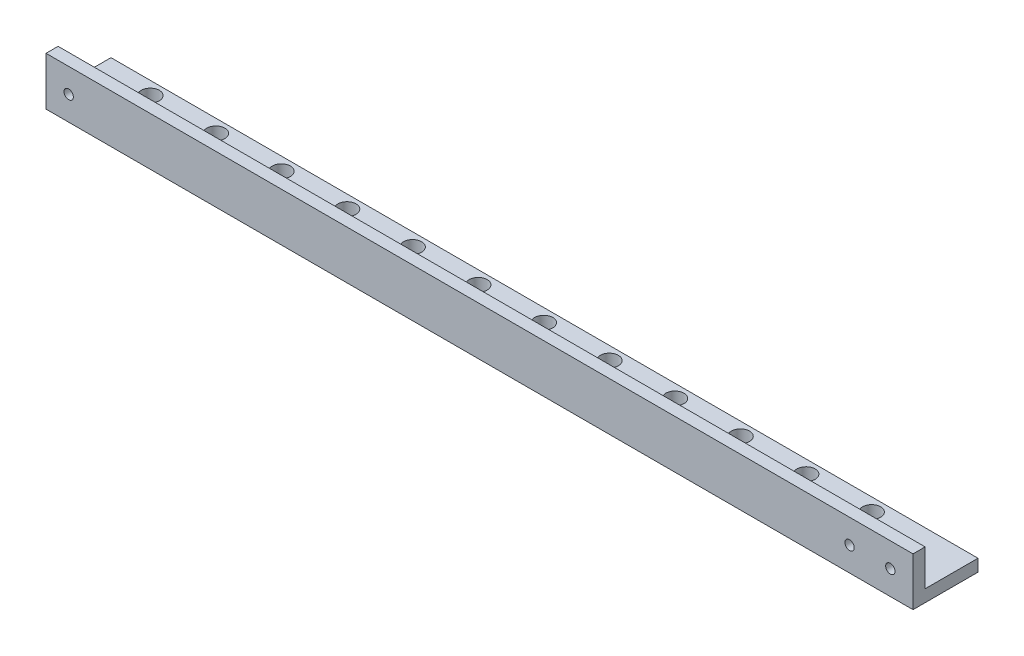
ISO-10303-21;
HEADER;
FILE_DESCRIPTION(('STEP AP214'),'2;1');
FILE_NAME('part.step','',(''),(''),'','','');
FILE_SCHEMA(('AUTOMOTIVE_DESIGN { 1 0 10303 214 1 1 1 1 }'));
ENDSEC;
DATA;
#1=APPLICATION_CONTEXT('core data for automotive mechanical design processes');
#2=APPLICATION_PROTOCOL_DEFINITION('international standard','automotive_design',2000,#1);
#3=PRODUCT_CONTEXT('',#1,'mechanical');
#4=PRODUCT('Part','Part','',(#3));
#5=PRODUCT_RELATED_PRODUCT_CATEGORY('part','',(#4));
#6=PRODUCT_DEFINITION_FORMATION('','',#4);
#7=PRODUCT_DEFINITION_CONTEXT('part definition',#1,'design');
#8=PRODUCT_DEFINITION('design','',#6,#7);
#9=PRODUCT_DEFINITION_SHAPE('','',#8);
#10=(LENGTH_UNIT() NAMED_UNIT(*) SI_UNIT(.MILLI.,.METRE.));
#11=(NAMED_UNIT(*) PLANE_ANGLE_UNIT() SI_UNIT($,.RADIAN.));
#12=(NAMED_UNIT(*) SI_UNIT($,.STERADIAN.) SOLID_ANGLE_UNIT());
#13=UNCERTAINTY_MEASURE_WITH_UNIT(LENGTH_MEASURE(1.E-05),#10,'distance_accuracy_value','');
#14=(GEOMETRIC_REPRESENTATION_CONTEXT(3) GLOBAL_UNCERTAINTY_ASSIGNED_CONTEXT((#13)) GLOBAL_UNIT_ASSIGNED_CONTEXT((#10,
#11,#12)) REPRESENTATION_CONTEXT('',''));
#15=CARTESIAN_POINT('',(0.,0.,0.));
#16=DIRECTION('',(0.,0.,1.));
#17=DIRECTION('',(1.,0.,0.));
#18=AXIS2_PLACEMENT_3D('',#15,#16,#17);
#19=CARTESIAN_POINT('',(0.,4.,0.));
#20=DIRECTION('',(0.,1.,0.));
#21=DIRECTION('',(0.,0.,1.));
#22=AXIS2_PLACEMENT_3D('',#19,#20,#21);
#23=PLANE('',#22);
#24=CARTESIAN_POINT('',(217.,4.,0.));
#25=DIRECTION('',(0.,1.,0.));
#26=DIRECTION('',(0.,0.,1.));
#27=AXIS2_PLACEMENT_3D('',#24,#25,#26);
#28=CIRCLE('',#27,2.99999999999999);
#29=CARTESIAN_POINT('',(217.,4.,2.99999999999999));
#30=VERTEX_POINT('',#29);
#31=EDGE_CURVE('E159',#30,#30,#28,.T.);
#32=ORIENTED_EDGE('',*,*,#31,.F.);
#33=EDGE_LOOP('',(#32));
#34=FACE_BOUND('',#33,.T.);
#35=CARTESIAN_POINT('',(173.6,4.,0.));
#36=DIRECTION('',(0.,1.,0.));
#37=DIRECTION('',(0.,0.,1.));
#38=AXIS2_PLACEMENT_3D('',#35,#36,#37);
#39=CIRCLE('',#38,2.99999999999999);
#40=CARTESIAN_POINT('',(173.6,4.,2.99999999999999));
#41=VERTEX_POINT('',#40);
#42=EDGE_CURVE('E171',#41,#41,#39,.T.);
#43=ORIENTED_EDGE('',*,*,#42,.F.);
#44=EDGE_LOOP('',(#43));
#45=FACE_BOUND('',#44,.T.);
#46=CARTESIAN_POINT('',(130.2,4.,0.));
#47=DIRECTION('',(0.,1.,0.));
#48=DIRECTION('',(0.,0.,1.));
#49=AXIS2_PLACEMENT_3D('',#46,#47,#48);
#50=CIRCLE('',#49,2.99999999999999);
#51=CARTESIAN_POINT('',(130.2,4.,2.99999999999999));
#52=VERTEX_POINT('',#51);
#53=EDGE_CURVE('E183',#52,#52,#50,.T.);
#54=ORIENTED_EDGE('',*,*,#53,.F.);
#55=EDGE_LOOP('',(#54));
#56=FACE_BOUND('',#55,.T.);
#57=CARTESIAN_POINT('',(86.8,4.,0.));
#58=DIRECTION('',(0.,1.,0.));
#59=DIRECTION('',(0.,0.,1.));
#60=AXIS2_PLACEMENT_3D('',#57,#58,#59);
#61=CIRCLE('',#60,2.99999999999999);
#62=CARTESIAN_POINT('',(86.8,4.,2.99999999999999));
#63=VERTEX_POINT('',#62);
#64=EDGE_CURVE('E195',#63,#63,#61,.T.);
#65=ORIENTED_EDGE('',*,*,#64,.F.);
#66=EDGE_LOOP('',(#65));
#67=FACE_BOUND('',#66,.T.);
#68=CARTESIAN_POINT('',(43.4,4.,0.));
#69=DIRECTION('',(0.,1.,0.));
#70=DIRECTION('',(0.,0.,1.));
#71=AXIS2_PLACEMENT_3D('',#68,#69,#70);
#72=CIRCLE('',#71,3.);
#73=CARTESIAN_POINT('',(43.4,4.,3.));
#74=VERTEX_POINT('',#73);
#75=EDGE_CURVE('E207',#74,#74,#72,.T.);
#76=ORIENTED_EDGE('',*,*,#75,.F.);
#77=EDGE_LOOP('',(#76));
#78=FACE_BOUND('',#77,.T.);
#79=CARTESIAN_POINT('',(0.,4.,0.));
#80=DIRECTION('',(0.,1.,0.));
#81=DIRECTION('',(0.,0.,1.));
#82=AXIS2_PLACEMENT_3D('',#79,#80,#81);
#83=CIRCLE('',#82,3.);
#84=CARTESIAN_POINT('',(0.,4.,3.));
#85=VERTEX_POINT('',#84);
#86=EDGE_CURVE('E97',#85,#85,#83,.T.);
#87=ORIENTED_EDGE('',*,*,#86,.F.);
#88=EDGE_LOOP('',(#87));
#89=FACE_BOUND('',#88,.T.);
#90=CARTESIAN_POINT('',(21.7,4.,0.));
#91=DIRECTION('',(0.,1.,0.));
#92=DIRECTION('',(0.,0.,1.));
#93=AXIS2_PLACEMENT_3D('',#90,#91,#92);
#94=CIRCLE('',#93,3.);
#95=CARTESIAN_POINT('',(21.7,4.,3.));
#96=VERTEX_POINT('',#95);
#97=EDGE_CURVE('E213',#96,#96,#94,.T.);
#98=ORIENTED_EDGE('',*,*,#97,.F.);
#99=EDGE_LOOP('',(#98));
#100=FACE_BOUND('',#99,.T.);
#101=CARTESIAN_POINT('',(65.1,4.,0.));
#102=DIRECTION('',(0.,1.,0.));
#103=DIRECTION('',(0.,0.,1.));
#104=AXIS2_PLACEMENT_3D('',#101,#102,#103);
#105=CIRCLE('',#104,2.99999999999999);
#106=CARTESIAN_POINT('',(65.1,4.,2.99999999999999));
#107=VERTEX_POINT('',#106);
#108=EDGE_CURVE('E201',#107,#107,#105,.T.);
#109=ORIENTED_EDGE('',*,*,#108,.F.);
#110=EDGE_LOOP('',(#109));
#111=FACE_BOUND('',#110,.T.);
#112=CARTESIAN_POINT('',(108.5,4.,0.));
#113=DIRECTION('',(0.,1.,0.));
#114=DIRECTION('',(0.,0.,1.));
#115=AXIS2_PLACEMENT_3D('',#112,#113,#114);
#116=CIRCLE('',#115,2.99999999999999);
#117=CARTESIAN_POINT('',(108.5,4.,2.99999999999999));
#118=VERTEX_POINT('',#117);
#119=EDGE_CURVE('E189',#118,#118,#116,.T.);
#120=ORIENTED_EDGE('',*,*,#119,.F.);
#121=EDGE_LOOP('',(#120));
#122=FACE_BOUND('',#121,.T.);
#123=CARTESIAN_POINT('',(151.9,4.,0.));
#124=DIRECTION('',(0.,1.,0.));
#125=DIRECTION('',(0.,0.,1.));
#126=AXIS2_PLACEMENT_3D('',#123,#124,#125);
#127=CIRCLE('',#126,2.99999999999999);
#128=CARTESIAN_POINT('',(151.9,4.,2.99999999999999));
#129=VERTEX_POINT('',#128);
#130=EDGE_CURVE('E177',#129,#129,#127,.T.);
#131=ORIENTED_EDGE('',*,*,#130,.F.);
#132=EDGE_LOOP('',(#131));
#133=FACE_BOUND('',#132,.T.);
#134=CARTESIAN_POINT('',(195.3,4.,0.));
#135=DIRECTION('',(0.,1.,0.));
#136=DIRECTION('',(0.,0.,1.));
#137=AXIS2_PLACEMENT_3D('',#134,#135,#136);
#138=CIRCLE('',#137,2.99999999999999);
#139=CARTESIAN_POINT('',(195.3,4.,2.99999999999999));
#140=VERTEX_POINT('',#139);
#141=EDGE_CURVE('E165',#140,#140,#138,.T.);
#142=ORIENTED_EDGE('',*,*,#141,.F.);
#143=EDGE_LOOP('',(#142));
#144=FACE_BOUND('',#143,.T.);
#145=CARTESIAN_POINT('',(238.7,4.,0.));
#146=DIRECTION('',(0.,1.,0.));
#147=DIRECTION('',(0.,0.,1.));
#148=AXIS2_PLACEMENT_3D('',#145,#146,#147);
#149=CIRCLE('',#148,2.99999999999999);
#150=CARTESIAN_POINT('',(238.7,4.,2.99999999999999));
#151=VERTEX_POINT('',#150);
#152=EDGE_CURVE('E153',#151,#151,#149,.T.);
#153=ORIENTED_EDGE('',*,*,#152,.F.);
#154=EDGE_LOOP('',(#153));
#155=FACE_BOUND('',#154,.T.);
#156=DIRECTION('',(0.,0.,1.));
#157=VECTOR('',#156,1.);
#158=CARTESIAN_POINT('',(-17.35,4.,-4.35));
#159=LINE('',#158,#157);
#160=CARTESIAN_POINT('',(-17.35,4.,-4.35));
#161=VERTEX_POINT('',#160);
#162=CARTESIAN_POINT('',(-17.35,3.99999999999997,13.15));
#163=VERTEX_POINT('',#162);
#164=EDGE_CURVE('E85',#161,#163,#159,.T.);
#165=ORIENTED_EDGE('',*,*,#164,.T.);
#166=DIRECTION('',(1.,0.,0.));
#167=VECTOR('',#166,1.);
#168=CARTESIAN_POINT('',(269.55,4.,13.15));
#169=LINE('',#168,#167);
#170=CARTESIAN_POINT('',(269.55,4.,13.15));
#171=VERTEX_POINT('',#170);
#172=EDGE_CURVE('E134',#163,#171,#169,.T.);
#173=ORIENTED_EDGE('',*,*,#172,.T.);
#174=DIRECTION('',(0.,0.,-1.));
#175=VECTOR('',#174,1.);
#176=CARTESIAN_POINT('',(269.55,4.,-4.35));
#177=LINE('',#176,#175);
#178=CARTESIAN_POINT('',(269.55,4.,-4.35));
#179=VERTEX_POINT('',#178);
#180=EDGE_CURVE('E141',#171,#179,#177,.T.);
#181=ORIENTED_EDGE('',*,*,#180,.T.);
#182=DIRECTION('',(-1.,0.,0.));
#183=VECTOR('',#182,1.);
#184=CARTESIAN_POINT('',(-17.35,4.,-4.35));
#185=LINE('',#184,#183);
#186=EDGE_CURVE('E56',#179,#161,#185,.T.);
#187=ORIENTED_EDGE('',*,*,#186,.T.);
#188=EDGE_LOOP('',(#165,#173,#181,#187));
#189=FACE_BOUND('',#188,.T.);
#190=ADVANCED_FACE('F32',(#34,#45,#56,#67,#78,#89,#100,#111,#122,#133,#144,#155,#189),#23,.T.);
#191=CARTESIAN_POINT('',(0.,0.,0.));
#192=DIRECTION('',(0.,1.,0.));
#193=DIRECTION('',(0.,0.,1.));
#194=AXIS2_PLACEMENT_3D('',#191,#192,#193);
#195=PLANE('',#194);
#196=DIRECTION('',(0.,0.,1.));
#197=VECTOR('',#196,1.);
#198=CARTESIAN_POINT('',(-17.35,0.,-4.35));
#199=LINE('',#198,#197);
#200=CARTESIAN_POINT('',(-17.35,0.,-4.35));
#201=VERTEX_POINT('',#200);
#202=CARTESIAN_POINT('',(-17.35,0.,17.15));
#203=VERTEX_POINT('',#202);
#204=EDGE_CURVE('E91',#201,#203,#199,.T.);
#205=ORIENTED_EDGE('',*,*,#204,.F.);
#206=DIRECTION('',(-1.,0.,0.));
#207=VECTOR('',#206,1.);
#208=CARTESIAN_POINT('',(-17.35,0.,-4.35));
#209=LINE('',#208,#207);
#210=CARTESIAN_POINT('',(269.55,0.,-4.35));
#211=VERTEX_POINT('',#210);
#212=EDGE_CURVE('E75',#211,#201,#209,.T.);
#213=ORIENTED_EDGE('',*,*,#212,.F.);
#214=DIRECTION('',(0.,0.,-1.));
#215=VECTOR('',#214,1.);
#216=CARTESIAN_POINT('',(269.55,0.,-4.35));
#217=LINE('',#216,#215);
#218=CARTESIAN_POINT('',(269.55,0.,17.15));
#219=VERTEX_POINT('',#218);
#220=EDGE_CURVE('E86',#219,#211,#217,.T.);
#221=ORIENTED_EDGE('',*,*,#220,.F.);
#222=DIRECTION('',(1.,0.,0.));
#223=VECTOR('',#222,1.);
#224=CARTESIAN_POINT('',(-17.35,0.,17.15));
#225=LINE('',#224,#223);
#226=EDGE_CURVE('E96',#203,#219,#225,.T.);
#227=ORIENTED_EDGE('',*,*,#226,.F.);
#228=EDGE_LOOP('',(#205,#213,#221,#227));
#229=FACE_BOUND('',#228,.T.);
#230=CARTESIAN_POINT('',(0.,0.,0.));
#231=DIRECTION('',(0.,1.,0.));
#232=DIRECTION('',(0.,0.,1.));
#233=AXIS2_PLACEMENT_3D('',#230,#231,#232);
#234=CIRCLE('',#233,3.);
#235=CARTESIAN_POINT('',(0.,0.,3.));
#236=VERTEX_POINT('',#235);
#237=EDGE_CURVE('E101',#236,#236,#234,.T.);
#238=ORIENTED_EDGE('',*,*,#237,.T.);
#239=EDGE_LOOP('',(#238));
#240=FACE_BOUND('',#239,.T.);
#241=CARTESIAN_POINT('',(21.7,0.,0.));
#242=DIRECTION('',(0.,1.,0.));
#243=DIRECTION('',(0.,0.,1.));
#244=AXIS2_PLACEMENT_3D('',#241,#242,#243);
#245=CIRCLE('',#244,3.);
#246=CARTESIAN_POINT('',(21.7,0.,3.));
#247=VERTEX_POINT('',#246);
#248=EDGE_CURVE('E210',#247,#247,#245,.T.);
#249=ORIENTED_EDGE('',*,*,#248,.T.);
#250=EDGE_LOOP('',(#249));
#251=FACE_BOUND('',#250,.T.);
#252=CARTESIAN_POINT('',(43.4,0.,0.));
#253=DIRECTION('',(0.,1.,0.));
#254=DIRECTION('',(0.,0.,1.));
#255=AXIS2_PLACEMENT_3D('',#252,#253,#254);
#256=CIRCLE('',#255,3.);
#257=CARTESIAN_POINT('',(43.4,0.,3.));
#258=VERTEX_POINT('',#257);
#259=EDGE_CURVE('E204',#258,#258,#256,.T.);
#260=ORIENTED_EDGE('',*,*,#259,.T.);
#261=EDGE_LOOP('',(#260));
#262=FACE_BOUND('',#261,.T.);
#263=CARTESIAN_POINT('',(65.1,0.,0.));
#264=DIRECTION('',(0.,1.,0.));
#265=DIRECTION('',(0.,0.,1.));
#266=AXIS2_PLACEMENT_3D('',#263,#264,#265);
#267=CIRCLE('',#266,2.99999999999999);
#268=CARTESIAN_POINT('',(65.1,0.,2.99999999999999));
#269=VERTEX_POINT('',#268);
#270=EDGE_CURVE('E198',#269,#269,#267,.T.);
#271=ORIENTED_EDGE('',*,*,#270,.T.);
#272=EDGE_LOOP('',(#271));
#273=FACE_BOUND('',#272,.T.);
#274=CARTESIAN_POINT('',(86.8,0.,0.));
#275=DIRECTION('',(0.,1.,0.));
#276=DIRECTION('',(0.,0.,1.));
#277=AXIS2_PLACEMENT_3D('',#274,#275,#276);
#278=CIRCLE('',#277,2.99999999999999);
#279=CARTESIAN_POINT('',(86.8,0.,2.99999999999999));
#280=VERTEX_POINT('',#279);
#281=EDGE_CURVE('E192',#280,#280,#278,.T.);
#282=ORIENTED_EDGE('',*,*,#281,.T.);
#283=EDGE_LOOP('',(#282));
#284=FACE_BOUND('',#283,.T.);
#285=CARTESIAN_POINT('',(108.5,0.,0.));
#286=DIRECTION('',(0.,1.,0.));
#287=DIRECTION('',(0.,0.,1.));
#288=AXIS2_PLACEMENT_3D('',#285,#286,#287);
#289=CIRCLE('',#288,2.99999999999999);
#290=CARTESIAN_POINT('',(108.5,0.,2.99999999999999));
#291=VERTEX_POINT('',#290);
#292=EDGE_CURVE('E186',#291,#291,#289,.T.);
#293=ORIENTED_EDGE('',*,*,#292,.T.);
#294=EDGE_LOOP('',(#293));
#295=FACE_BOUND('',#294,.T.);
#296=CARTESIAN_POINT('',(130.2,0.,0.));
#297=DIRECTION('',(0.,1.,0.));
#298=DIRECTION('',(0.,0.,1.));
#299=AXIS2_PLACEMENT_3D('',#296,#297,#298);
#300=CIRCLE('',#299,2.99999999999999);
#301=CARTESIAN_POINT('',(130.2,0.,2.99999999999999));
#302=VERTEX_POINT('',#301);
#303=EDGE_CURVE('E180',#302,#302,#300,.T.);
#304=ORIENTED_EDGE('',*,*,#303,.T.);
#305=EDGE_LOOP('',(#304));
#306=FACE_BOUND('',#305,.T.);
#307=CARTESIAN_POINT('',(151.9,0.,0.));
#308=DIRECTION('',(0.,1.,0.));
#309=DIRECTION('',(0.,0.,1.));
#310=AXIS2_PLACEMENT_3D('',#307,#308,#309);
#311=CIRCLE('',#310,2.99999999999999);
#312=CARTESIAN_POINT('',(151.9,0.,2.99999999999999));
#313=VERTEX_POINT('',#312);
#314=EDGE_CURVE('E174',#313,#313,#311,.T.);
#315=ORIENTED_EDGE('',*,*,#314,.T.);
#316=EDGE_LOOP('',(#315));
#317=FACE_BOUND('',#316,.T.);
#318=CARTESIAN_POINT('',(173.6,0.,0.));
#319=DIRECTION('',(0.,1.,0.));
#320=DIRECTION('',(0.,0.,1.));
#321=AXIS2_PLACEMENT_3D('',#318,#319,#320);
#322=CIRCLE('',#321,2.99999999999999);
#323=CARTESIAN_POINT('',(173.6,0.,2.99999999999999));
#324=VERTEX_POINT('',#323);
#325=EDGE_CURVE('E168',#324,#324,#322,.T.);
#326=ORIENTED_EDGE('',*,*,#325,.T.);
#327=EDGE_LOOP('',(#326));
#328=FACE_BOUND('',#327,.T.);
#329=CARTESIAN_POINT('',(195.3,0.,0.));
#330=DIRECTION('',(0.,1.,0.));
#331=DIRECTION('',(0.,0.,1.));
#332=AXIS2_PLACEMENT_3D('',#329,#330,#331);
#333=CIRCLE('',#332,2.99999999999999);
#334=CARTESIAN_POINT('',(195.3,0.,2.99999999999999));
#335=VERTEX_POINT('',#334);
#336=EDGE_CURVE('E162',#335,#335,#333,.T.);
#337=ORIENTED_EDGE('',*,*,#336,.T.);
#338=EDGE_LOOP('',(#337));
#339=FACE_BOUND('',#338,.T.);
#340=CARTESIAN_POINT('',(217.,0.,0.));
#341=DIRECTION('',(0.,1.,0.));
#342=DIRECTION('',(0.,0.,1.));
#343=AXIS2_PLACEMENT_3D('',#340,#341,#342);
#344=CIRCLE('',#343,2.99999999999999);
#345=CARTESIAN_POINT('',(217.,0.,2.99999999999999));
#346=VERTEX_POINT('',#345);
#347=EDGE_CURVE('E156',#346,#346,#344,.T.);
#348=ORIENTED_EDGE('',*,*,#347,.T.);
#349=EDGE_LOOP('',(#348));
#350=FACE_BOUND('',#349,.T.);
#351=CARTESIAN_POINT('',(238.7,0.,0.));
#352=DIRECTION('',(0.,1.,0.));
#353=DIRECTION('',(0.,0.,1.));
#354=AXIS2_PLACEMENT_3D('',#351,#352,#353);
#355=CIRCLE('',#354,2.99999999999999);
#356=CARTESIAN_POINT('',(238.7,0.,2.99999999999999));
#357=VERTEX_POINT('',#356);
#358=EDGE_CURVE('E151',#357,#357,#355,.T.);
#359=ORIENTED_EDGE('',*,*,#358,.T.);
#360=EDGE_LOOP('',(#359));
#361=FACE_BOUND('',#360,.T.);
#362=ADVANCED_FACE('F94',(#229,#240,#251,#262,#273,#284,#295,#306,#317,#328,#339,#350,#361),
#195,.F.);
#363=CARTESIAN_POINT('',(-17.35,4.,-4.35));
#364=DIRECTION('',(1.,0.,0.));
#365=DIRECTION('',(0.,0.,-1.));
#366=AXIS2_PLACEMENT_3D('',#363,#364,#365);
#367=PLANE('',#366);
#368=ORIENTED_EDGE('',*,*,#204,.T.);
#369=DIRECTION('',(0.,-1.,0.));
#370=VECTOR('',#369,1.);
#371=CARTESIAN_POINT('',(-17.35,4.,17.15));
#372=LINE('',#371,#370);
#373=CARTESIAN_POINT('',(-17.35,16.,17.15));
#374=VERTEX_POINT('',#373);
#375=EDGE_CURVE('E11',#374,#203,#372,.T.);
#376=ORIENTED_EDGE('',*,*,#375,.F.);
#377=DIRECTION('',(0.,0.,1.));
#378=VECTOR('',#377,1.);
#379=CARTESIAN_POINT('',(-17.35,16.,13.15));
#380=LINE('',#379,#378);
#381=CARTESIAN_POINT('',(-17.35,16.,13.15));
#382=VERTEX_POINT('',#381);
#383=EDGE_CURVE('E133',#382,#374,#380,.T.);
#384=ORIENTED_EDGE('',*,*,#383,.F.);
#385=DIRECTION('',(0.,-1.,0.));
#386=VECTOR('',#385,1.);
#387=CARTESIAN_POINT('',(-17.35,3.99999999999997,13.15));
#388=LINE('',#387,#386);
#389=EDGE_CURVE('E138',#382,#163,#388,.T.);
#390=ORIENTED_EDGE('',*,*,#389,.T.);
#391=ORIENTED_EDGE('',*,*,#164,.F.);
#392=DIRECTION('',(0.,-1.,0.));
#393=VECTOR('',#392,1.);
#394=CARTESIAN_POINT('',(-17.35,4.,-4.35));
#395=LINE('',#394,#393);
#396=EDGE_CURVE('E78',#161,#201,#395,.T.);
#397=ORIENTED_EDGE('',*,*,#396,.T.);
#398=EDGE_LOOP('',(#368,#376,#384,#390,#391,#397));
#399=FACE_BOUND('',#398,.T.);
#400=ADVANCED_FACE('F34',(#399),#367,.F.);
#401=CARTESIAN_POINT('',(-17.35,4.,17.15));
#402=DIRECTION('',(0.,0.,-1.));
#403=DIRECTION('',(-1.,0.,0.));
#404=AXIS2_PLACEMENT_3D('',#401,#402,#403);
#405=PLANE('',#404);
#406=CARTESIAN_POINT('',(262.05,8.,17.15));
#407=DIRECTION('',(0.,0.,1.));
#408=DIRECTION('',(1.,0.,0.));
#409=AXIS2_PLACEMENT_3D('',#406,#407,#408);
#410=CIRCLE('',#409,1.54999999999999);
#411=CARTESIAN_POINT('',(263.6,8.,17.15));
#412=VERTEX_POINT('',#411);
#413=EDGE_CURVE('E143',#412,#412,#410,.T.);
#414=ORIENTED_EDGE('',*,*,#413,.F.);
#415=EDGE_LOOP('',(#414));
#416=FACE_BOUND('',#415,.T.);
#417=CARTESIAN_POINT('',(248.55,8.,17.15));
#418=DIRECTION('',(0.,0.,1.));
#419=DIRECTION('',(1.,0.,0.));
#420=AXIS2_PLACEMENT_3D('',#417,#418,#419);
#421=CIRCLE('',#420,1.54999999999999);
#422=CARTESIAN_POINT('',(250.1,8.,17.15));
#423=VERTEX_POINT('',#422);
#424=EDGE_CURVE('E247',#423,#423,#421,.T.);
#425=ORIENTED_EDGE('',*,*,#424,.F.);
#426=EDGE_LOOP('',(#425));
#427=FACE_BOUND('',#426,.T.);
#428=CARTESIAN_POINT('',(-9.84999999999995,8.,17.15));
#429=DIRECTION('',(0.,0.,1.));
#430=DIRECTION('',(1.,0.,0.));
#431=AXIS2_PLACEMENT_3D('',#428,#429,#430);
#432=CIRCLE('',#431,1.55);
#433=CARTESIAN_POINT('',(-8.29999999999995,8.,17.15));
#434=VERTEX_POINT('',#433);
#435=EDGE_CURVE('E250',#434,#434,#432,.T.);
#436=ORIENTED_EDGE('',*,*,#435,.F.);
#437=EDGE_LOOP('',(#436));
#438=FACE_BOUND('',#437,.T.);
#439=ORIENTED_EDGE('',*,*,#226,.T.);
#440=DIRECTION('',(0.,-1.,0.));
#441=VECTOR('',#440,1.);
#442=CARTESIAN_POINT('',(269.55,4.,17.15));
#443=LINE('',#442,#441);
#444=CARTESIAN_POINT('',(269.55,16.,17.15));
#445=VERTEX_POINT('',#444);
#446=EDGE_CURVE('E40',#445,#219,#443,.T.);
#447=ORIENTED_EDGE('',*,*,#446,.F.);
#448=DIRECTION('',(-1.,0.,0.));
#449=VECTOR('',#448,1.);
#450=CARTESIAN_POINT('',(269.55,16.,17.15));
#451=LINE('',#450,#449);
#452=EDGE_CURVE('E120',#445,#374,#451,.T.);
#453=ORIENTED_EDGE('',*,*,#452,.T.);
#454=ORIENTED_EDGE('',*,*,#375,.T.);
#455=EDGE_LOOP('',(#439,#447,#453,#454));
#456=FACE_BOUND('',#455,.T.);
#457=ADVANCED_FACE('F118',(#416,#427,#438,#456),#405,.F.);
#458=CARTESIAN_POINT('',(269.55,4.,-4.35));
#459=DIRECTION('',(-1.,0.,0.));
#460=DIRECTION('',(0.,0.,1.));
#461=AXIS2_PLACEMENT_3D('',#458,#459,#460);
#462=PLANE('',#461);
#463=ORIENTED_EDGE('',*,*,#220,.T.);
#464=DIRECTION('',(0.,-1.,0.));
#465=VECTOR('',#464,1.);
#466=CARTESIAN_POINT('',(269.55,4.,-4.35));
#467=LINE('',#466,#465);
#468=EDGE_CURVE('E81',#179,#211,#467,.T.);
#469=ORIENTED_EDGE('',*,*,#468,.F.);
#470=ORIENTED_EDGE('',*,*,#180,.F.);
#471=DIRECTION('',(0.,1.,0.));
#472=VECTOR('',#471,1.);
#473=CARTESIAN_POINT('',(269.55,4.,13.15));
#474=LINE('',#473,#472);
#475=CARTESIAN_POINT('',(269.55,16.,13.15));
#476=VERTEX_POINT('',#475);
#477=EDGE_CURVE('E47',#171,#476,#474,.T.);
#478=ORIENTED_EDGE('',*,*,#477,.T.);
#479=DIRECTION('',(0.,0.,1.));
#480=VECTOR('',#479,1.);
#481=CARTESIAN_POINT('',(269.55,16.,13.15));
#482=LINE('',#481,#480);
#483=EDGE_CURVE('E114',#476,#445,#482,.T.);
#484=ORIENTED_EDGE('',*,*,#483,.T.);
#485=ORIENTED_EDGE('',*,*,#446,.T.);
#486=EDGE_LOOP('',(#463,#469,#470,#478,#484,#485));
#487=FACE_BOUND('',#486,.T.);
#488=ADVANCED_FACE('F111',(#487),#462,.F.);
#489=CARTESIAN_POINT('',(-17.35,4.,-4.35));
#490=DIRECTION('',(0.,0.,1.));
#491=DIRECTION('',(1.,0.,0.));
#492=AXIS2_PLACEMENT_3D('',#489,#490,#491);
#493=PLANE('',#492);
#494=ORIENTED_EDGE('',*,*,#212,.T.);
#495=ORIENTED_EDGE('',*,*,#396,.F.);
#496=ORIENTED_EDGE('',*,*,#186,.F.);
#497=ORIENTED_EDGE('',*,*,#468,.T.);
#498=EDGE_LOOP('',(#494,#495,#496,#497));
#499=FACE_BOUND('',#498,.T.);
#500=ADVANCED_FACE('F77',(#499),#493,.F.);
#501=CARTESIAN_POINT('',(0.,4.,0.));
#502=DIRECTION('',(0.,-1.,0.));
#503=DIRECTION('',(0.,0.,-1.));
#504=AXIS2_PLACEMENT_3D('',#501,#502,#503);
#505=CYLINDRICAL_SURFACE('',#504,3.);
#506=ORIENTED_EDGE('',*,*,#86,.T.);
#507=EDGE_LOOP('',(#506));
#508=FACE_BOUND('',#507,.T.);
#509=ORIENTED_EDGE('',*,*,#237,.F.);
#510=EDGE_LOOP('',(#509));
#511=FACE_BOUND('',#510,.T.);
#512=ADVANCED_FACE('F230',(#508,#511),#505,.F.);
#513=CARTESIAN_POINT('',(21.7,4.,0.));
#514=DIRECTION('',(0.,-1.,0.));
#515=DIRECTION('',(0.,0.,-1.));
#516=AXIS2_PLACEMENT_3D('',#513,#514,#515);
#517=CYLINDRICAL_SURFACE('',#516,3.);
#518=ORIENTED_EDGE('',*,*,#97,.T.);
#519=EDGE_LOOP('',(#518));
#520=FACE_BOUND('',#519,.T.);
#521=ORIENTED_EDGE('',*,*,#248,.F.);
#522=EDGE_LOOP('',(#521));
#523=FACE_BOUND('',#522,.T.);
#524=ADVANCED_FACE('F325',(#520,#523),#517,.F.);
#525=CARTESIAN_POINT('',(43.4,4.,0.));
#526=DIRECTION('',(0.,-1.,0.));
#527=DIRECTION('',(0.,0.,-1.));
#528=AXIS2_PLACEMENT_3D('',#525,#526,#527);
#529=CYLINDRICAL_SURFACE('',#528,3.);
#530=ORIENTED_EDGE('',*,*,#75,.T.);
#531=EDGE_LOOP('',(#530));
#532=FACE_BOUND('',#531,.T.);
#533=ORIENTED_EDGE('',*,*,#259,.F.);
#534=EDGE_LOOP('',(#533));
#535=FACE_BOUND('',#534,.T.);
#536=ADVANCED_FACE('F322',(#532,#535),#529,.F.);
#537=CARTESIAN_POINT('',(65.1,4.,0.));
#538=DIRECTION('',(0.,-1.,0.));
#539=DIRECTION('',(0.,0.,-1.));
#540=AXIS2_PLACEMENT_3D('',#537,#538,#539);
#541=CYLINDRICAL_SURFACE('',#540,2.99999999999999);
#542=ORIENTED_EDGE('',*,*,#108,.T.);
#543=EDGE_LOOP('',(#542));
#544=FACE_BOUND('',#543,.T.);
#545=ORIENTED_EDGE('',*,*,#270,.F.);
#546=EDGE_LOOP('',(#545));
#547=FACE_BOUND('',#546,.T.);
#548=ADVANCED_FACE('F318',(#544,#547),#541,.F.);
#549=CARTESIAN_POINT('',(86.8,4.,0.));
#550=DIRECTION('',(0.,-1.,0.));
#551=DIRECTION('',(0.,0.,-1.));
#552=AXIS2_PLACEMENT_3D('',#549,#550,#551);
#553=CYLINDRICAL_SURFACE('',#552,2.99999999999999);
#554=ORIENTED_EDGE('',*,*,#64,.T.);
#555=EDGE_LOOP('',(#554));
#556=FACE_BOUND('',#555,.T.);
#557=ORIENTED_EDGE('',*,*,#281,.F.);
#558=EDGE_LOOP('',(#557));
#559=FACE_BOUND('',#558,.T.);
#560=ADVANCED_FACE('F314',(#556,#559),#553,.F.);
#561=CARTESIAN_POINT('',(108.5,4.,0.));
#562=DIRECTION('',(0.,-1.,0.));
#563=DIRECTION('',(0.,0.,-1.));
#564=AXIS2_PLACEMENT_3D('',#561,#562,#563);
#565=CYLINDRICAL_SURFACE('',#564,2.99999999999999);
#566=ORIENTED_EDGE('',*,*,#119,.T.);
#567=EDGE_LOOP('',(#566));
#568=FACE_BOUND('',#567,.T.);
#569=ORIENTED_EDGE('',*,*,#292,.F.);
#570=EDGE_LOOP('',(#569));
#571=FACE_BOUND('',#570,.T.);
#572=ADVANCED_FACE('F310',(#568,#571),#565,.F.);
#573=CARTESIAN_POINT('',(130.2,4.,0.));
#574=DIRECTION('',(0.,-1.,0.));
#575=DIRECTION('',(0.,0.,-1.));
#576=AXIS2_PLACEMENT_3D('',#573,#574,#575);
#577=CYLINDRICAL_SURFACE('',#576,2.99999999999999);
#578=ORIENTED_EDGE('',*,*,#53,.T.);
#579=EDGE_LOOP('',(#578));
#580=FACE_BOUND('',#579,.T.);
#581=ORIENTED_EDGE('',*,*,#303,.F.);
#582=EDGE_LOOP('',(#581));
#583=FACE_BOUND('',#582,.T.);
#584=ADVANCED_FACE('F306',(#580,#583),#577,.F.);
#585=CARTESIAN_POINT('',(151.9,4.,0.));
#586=DIRECTION('',(0.,-1.,0.));
#587=DIRECTION('',(0.,0.,-1.));
#588=AXIS2_PLACEMENT_3D('',#585,#586,#587);
#589=CYLINDRICAL_SURFACE('',#588,2.99999999999999);
#590=ORIENTED_EDGE('',*,*,#130,.T.);
#591=EDGE_LOOP('',(#590));
#592=FACE_BOUND('',#591,.T.);
#593=ORIENTED_EDGE('',*,*,#314,.F.);
#594=EDGE_LOOP('',(#593));
#595=FACE_BOUND('',#594,.T.);
#596=ADVANCED_FACE('F302',(#592,#595),#589,.F.);
#597=CARTESIAN_POINT('',(173.6,4.,0.));
#598=DIRECTION('',(0.,-1.,0.));
#599=DIRECTION('',(0.,0.,-1.));
#600=AXIS2_PLACEMENT_3D('',#597,#598,#599);
#601=CYLINDRICAL_SURFACE('',#600,2.99999999999999);
#602=ORIENTED_EDGE('',*,*,#42,.T.);
#603=EDGE_LOOP('',(#602));
#604=FACE_BOUND('',#603,.T.);
#605=ORIENTED_EDGE('',*,*,#325,.F.);
#606=EDGE_LOOP('',(#605));
#607=FACE_BOUND('',#606,.T.);
#608=ADVANCED_FACE('F298',(#604,#607),#601,.F.);
#609=CARTESIAN_POINT('',(195.3,4.,0.));
#610=DIRECTION('',(0.,-1.,0.));
#611=DIRECTION('',(0.,0.,-1.));
#612=AXIS2_PLACEMENT_3D('',#609,#610,#611);
#613=CYLINDRICAL_SURFACE('',#612,2.99999999999999);
#614=ORIENTED_EDGE('',*,*,#141,.T.);
#615=EDGE_LOOP('',(#614));
#616=FACE_BOUND('',#615,.T.);
#617=ORIENTED_EDGE('',*,*,#336,.F.);
#618=EDGE_LOOP('',(#617));
#619=FACE_BOUND('',#618,.T.);
#620=ADVANCED_FACE('F294',(#616,#619),#613,.F.);
#621=CARTESIAN_POINT('',(217.,4.,0.));
#622=DIRECTION('',(0.,-1.,0.));
#623=DIRECTION('',(0.,0.,-1.));
#624=AXIS2_PLACEMENT_3D('',#621,#622,#623);
#625=CYLINDRICAL_SURFACE('',#624,2.99999999999999);
#626=ORIENTED_EDGE('',*,*,#31,.T.);
#627=EDGE_LOOP('',(#626));
#628=FACE_BOUND('',#627,.T.);
#629=ORIENTED_EDGE('',*,*,#347,.F.);
#630=EDGE_LOOP('',(#629));
#631=FACE_BOUND('',#630,.T.);
#632=ADVANCED_FACE('F290',(#628,#631),#625,.F.);
#633=CARTESIAN_POINT('',(238.7,4.,0.));
#634=DIRECTION('',(0.,-1.,0.));
#635=DIRECTION('',(0.,0.,-1.));
#636=AXIS2_PLACEMENT_3D('',#633,#634,#635);
#637=CYLINDRICAL_SURFACE('',#636,2.99999999999999);
#638=ORIENTED_EDGE('',*,*,#152,.T.);
#639=EDGE_LOOP('',(#638));
#640=FACE_BOUND('',#639,.T.);
#641=ORIENTED_EDGE('',*,*,#358,.F.);
#642=EDGE_LOOP('',(#641));
#643=FACE_BOUND('',#642,.T.);
#644=ADVANCED_FACE('F287',(#640,#643),#637,.F.);
#645=CARTESIAN_POINT('',(269.55,16.,13.15));
#646=DIRECTION('',(0.,1.,0.));
#647=DIRECTION('',(-1.,0.,0.));
#648=AXIS2_PLACEMENT_3D('',#645,#646,#647);
#649=PLANE('',#648);
#650=ORIENTED_EDGE('',*,*,#452,.F.);
#651=ORIENTED_EDGE('',*,*,#483,.F.);
#652=DIRECTION('',(-1.,0.,0.));
#653=VECTOR('',#652,1.);
#654=CARTESIAN_POINT('',(269.55,16.,13.15));
#655=LINE('',#654,#653);
#656=EDGE_CURVE('E132',#476,#382,#655,.T.);
#657=ORIENTED_EDGE('',*,*,#656,.T.);
#658=ORIENTED_EDGE('',*,*,#383,.T.);
#659=EDGE_LOOP('',(#650,#651,#657,#658));
#660=FACE_BOUND('',#659,.T.);
#661=ADVANCED_FACE('F130',(#660),#649,.T.);
#662=CARTESIAN_POINT('',(0.,0.,13.15));
#663=DIRECTION('',(0.,0.,1.));
#664=DIRECTION('',(1.,0.,0.));
#665=AXIS2_PLACEMENT_3D('',#662,#663,#664);
#666=PLANE('',#665);
#667=CARTESIAN_POINT('',(262.05,8.,13.1499999999847));
#668=DIRECTION('',(0.,0.,1.));
#669=DIRECTION('',(1.,0.,0.));
#670=AXIS2_PLACEMENT_3D('',#667,#668,#669);
#671=CIRCLE('',#670,1.54999999999999);
#672=CARTESIAN_POINT('',(263.6,8.,13.1499999999847));
#673=VERTEX_POINT('',#672);
#674=EDGE_CURVE('E258',#673,#673,#671,.T.);
#675=ORIENTED_EDGE('',*,*,#674,.T.);
#676=EDGE_LOOP('',(#675));
#677=FACE_BOUND('',#676,.T.);
#678=CARTESIAN_POINT('',(248.55,8.,13.1499999999847));
#679=DIRECTION('',(0.,0.,1.));
#680=DIRECTION('',(1.,0.,0.));
#681=AXIS2_PLACEMENT_3D('',#678,#679,#680);
#682=CIRCLE('',#681,1.54999999999999);
#683=CARTESIAN_POINT('',(250.1,8.,13.1499999999847));
#684=VERTEX_POINT('',#683);
#685=EDGE_CURVE('E252',#684,#684,#682,.T.);
#686=ORIENTED_EDGE('',*,*,#685,.T.);
#687=EDGE_LOOP('',(#686));
#688=FACE_BOUND('',#687,.T.);
#689=CARTESIAN_POINT('',(-9.84999999999995,8.,13.1499999999847));
#690=DIRECTION('',(0.,0.,1.));
#691=DIRECTION('',(1.,0.,0.));
#692=AXIS2_PLACEMENT_3D('',#689,#690,#691);
#693=CIRCLE('',#692,1.55);
#694=CARTESIAN_POINT('',(-8.29999999999995,8.,13.1499999999847));
#695=VERTEX_POINT('',#694);
#696=EDGE_CURVE('E146',#695,#695,#693,.T.);
#697=ORIENTED_EDGE('',*,*,#696,.T.);
#698=EDGE_LOOP('',(#697));
#699=FACE_BOUND('',#698,.T.);
#700=ORIENTED_EDGE('',*,*,#477,.F.);
#701=ORIENTED_EDGE('',*,*,#172,.F.);
#702=ORIENTED_EDGE('',*,*,#389,.F.);
#703=ORIENTED_EDGE('',*,*,#656,.F.);
#704=EDGE_LOOP('',(#700,#701,#702,#703));
#705=FACE_BOUND('',#704,.T.);
#706=ADVANCED_FACE('F137',(#677,#688,#699,#705),#666,.F.);
#707=CARTESIAN_POINT('',(-9.84999999999995,8.,17.15));
#708=DIRECTION('',(0.,0.,-1.));
#709=DIRECTION('',(-1.,0.,0.));
#710=AXIS2_PLACEMENT_3D('',#707,#708,#709);
#711=CYLINDRICAL_SURFACE('',#710,1.55);
#712=ORIENTED_EDGE('',*,*,#435,.T.);
#713=EDGE_LOOP('',(#712));
#714=FACE_BOUND('',#713,.T.);
#715=ORIENTED_EDGE('',*,*,#696,.F.);
#716=EDGE_LOOP('',(#715));
#717=FACE_BOUND('',#716,.T.);
#718=ADVANCED_FACE('F271',(#714,#717),#711,.F.);
#719=CARTESIAN_POINT('',(248.55,8.,17.15));
#720=DIRECTION('',(0.,0.,-1.));
#721=DIRECTION('',(-1.,0.,0.));
#722=AXIS2_PLACEMENT_3D('',#719,#720,#721);
#723=CYLINDRICAL_SURFACE('',#722,1.54999999999999);
#724=ORIENTED_EDGE('',*,*,#424,.T.);
#725=EDGE_LOOP('',(#724));
#726=FACE_BOUND('',#725,.T.);
#727=ORIENTED_EDGE('',*,*,#685,.F.);
#728=EDGE_LOOP('',(#727));
#729=FACE_BOUND('',#728,.T.);
#730=ADVANCED_FACE('F265',(#726,#729),#723,.F.);
#731=CARTESIAN_POINT('',(262.05,8.,17.15));
#732=DIRECTION('',(0.,0.,-1.));
#733=DIRECTION('',(-1.,0.,0.));
#734=AXIS2_PLACEMENT_3D('',#731,#732,#733);
#735=CYLINDRICAL_SURFACE('',#734,1.54999999999999);
#736=ORIENTED_EDGE('',*,*,#413,.T.);
#737=EDGE_LOOP('',(#736));
#738=FACE_BOUND('',#737,.T.);
#739=ORIENTED_EDGE('',*,*,#674,.F.);
#740=EDGE_LOOP('',(#739));
#741=FACE_BOUND('',#740,.T.);
#742=ADVANCED_FACE('F262',(#738,#741),#735,.F.);
#743=CLOSED_SHELL('',(#190,#362,#400,#457,#488,#500,#512,#524,#536,#548,#560,#572,#584,#596,
#608,#620,#632,#644,#661,#706,#718,#730,#742));
#744=MANIFOLD_SOLID_BREP('B2',#743);
#745=ADVANCED_BREP_SHAPE_REPRESENTATION('',(#18,#744),#14);
#746=SHAPE_DEFINITION_REPRESENTATION(#9,#745);
ENDSEC;
END-ISO-10303-21;
